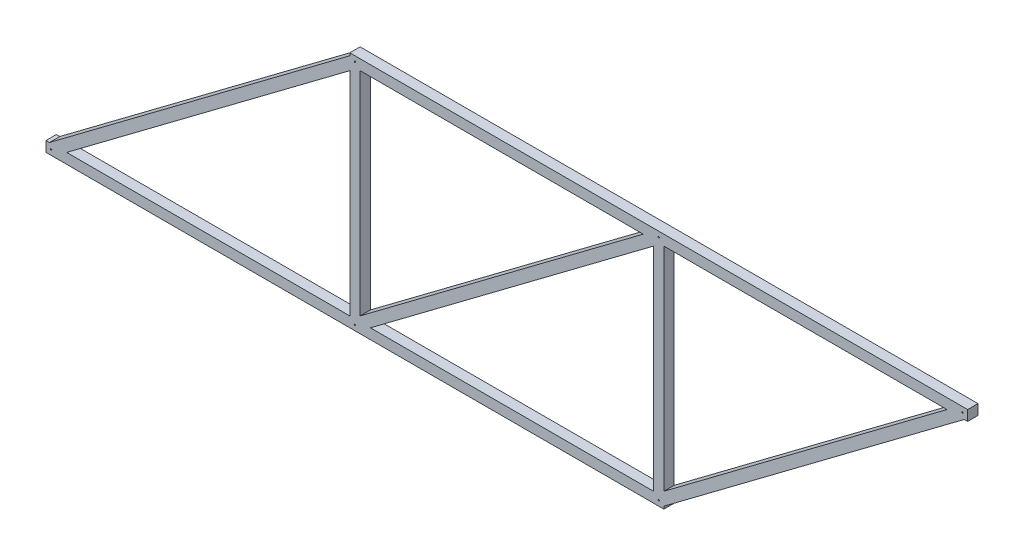
ISO-10303-21;
HEADER;
FILE_DESCRIPTION(('STEP AP214'),'2;1');
FILE_NAME('part.step','',(''),(''),'','','');
FILE_SCHEMA(('AUTOMOTIVE_DESIGN { 1 0 10303 214 1 1 1 1 }'));
ENDSEC;
DATA;
#1=APPLICATION_CONTEXT('core data for automotive mechanical design processes');
#2=APPLICATION_PROTOCOL_DEFINITION('international standard','automotive_design',2000,#1);
#3=PRODUCT_CONTEXT('',#1,'mechanical');
#4=PRODUCT('Part','Part','',(#3));
#5=PRODUCT_RELATED_PRODUCT_CATEGORY('part','',(#4));
#6=PRODUCT_DEFINITION_FORMATION('','',#4);
#7=PRODUCT_DEFINITION_CONTEXT('part definition',#1,'design');
#8=PRODUCT_DEFINITION('design','',#6,#7);
#9=PRODUCT_DEFINITION_SHAPE('','',#8);
#10=(LENGTH_UNIT() NAMED_UNIT(*) SI_UNIT(.MILLI.,.METRE.));
#11=(NAMED_UNIT(*) PLANE_ANGLE_UNIT() SI_UNIT($,.RADIAN.));
#12=(NAMED_UNIT(*) SI_UNIT($,.STERADIAN.) SOLID_ANGLE_UNIT());
#13=UNCERTAINTY_MEASURE_WITH_UNIT(LENGTH_MEASURE(1.E-05),#10,'distance_accuracy_value','');
#14=(GEOMETRIC_REPRESENTATION_CONTEXT(3) GLOBAL_UNCERTAINTY_ASSIGNED_CONTEXT((#13)) GLOBAL_UNIT_ASSIGNED_CONTEXT((#10,
#11,#12)) REPRESENTATION_CONTEXT('',''));
#15=CARTESIAN_POINT('',(0.,0.,0.));
#16=DIRECTION('',(0.,0.,1.));
#17=DIRECTION('',(1.,0.,0.));
#18=AXIS2_PLACEMENT_3D('',#15,#16,#17);
#19=CARTESIAN_POINT('',(0.,0.,13.6));
#20=DIRECTION('',(0.,0.,-1.));
#21=DIRECTION('',(-1.,0.,0.));
#22=AXIS2_PLACEMENT_3D('',#19,#20,#21);
#23=PLANE('',#22);
#24=DIRECTION('',(0.799999999956477,0.600000000058031,0.));
#25=VECTOR('',#24,1.);
#26=CARTESIAN_POINT('',(-394683.243710483,-296314.132827642,13.6));
#27=LINE('',#26,#25);
#28=CARTESIAN_POINT('',(406.799999999958,3.40000000039709,13.6));
#29=VERTEX_POINT('',#28);
#30=CARTESIAN_POINT('',(802.266666606442,300.000000000006,13.6));
#31=VERTEX_POINT('',#30);
#32=EDGE_CURVE('E708',#29,#31,#27,.T.);
#33=ORIENTED_EDGE('',*,*,#32,.T.);
#34=DIRECTION('',(-1.,1.22451067267071E-13,0.));
#35=VECTOR('',#34,1.);
#36=CARTESIAN_POINT('',(-399390.480730774,300.00000004901,13.6));
#37=LINE('',#36,#35);
#38=CARTESIAN_POINT('',(806.799999999967,300.000000000011,13.6));
#39=VERTEX_POINT('',#38);
#40=EDGE_CURVE('E711',#39,#31,#37,.T.);
#41=ORIENTED_EDGE('',*,*,#40,.F.);
#42=DIRECTION('',(1.14287664299616E-13,-1.,0.));
#43=VECTOR('',#42,1.);
#44=CARTESIAN_POINT('',(806.800000033149,-290037.816801442,13.6));
#45=LINE('',#44,#43);
#46=CARTESIAN_POINT('',(806.799999999953,313.60000000003,13.6));
#47=VERTEX_POINT('',#46);
#48=EDGE_CURVE('E716',#47,#39,#45,.T.);
#49=ORIENTED_EDGE('',*,*,#48,.F.);
#50=DIRECTION('',(1.,4.89804275566681E-13,0.));
#51=VECTOR('',#50,1.);
#52=CARTESIAN_POINT('',(-399390.480730952,313.599999804012,13.6));
#53=LINE('',#52,#51);
#54=CARTESIAN_POINT('',(-6.79999999998601,313.59999999961,13.6));
#55=VERTEX_POINT('',#54);
#56=EDGE_CURVE('E720',#55,#47,#53,.T.);
#57=ORIENTED_EDGE('',*,*,#56,.F.);
#58=DIRECTION('',(2.84698738951603E-13,1.,0.));
#59=VECTOR('',#58,1.);
#60=CARTESIAN_POINT('',(-6.80000008264869,-290037.816801602,13.6));
#61=LINE('',#60,#59);
#62=CARTESIAN_POINT('',(-6.79999999999836,310.200000045143,13.6));
#63=VERTEX_POINT('',#62);
#64=EDGE_CURVE('E724',#63,#55,#61,.T.);
#65=ORIENTED_EDGE('',*,*,#64,.F.);
#66=DIRECTION('',(-0.799999999956419,-0.600000000058108,0.));
#67=VECTOR('',#66,1.);
#68=CARTESIAN_POINT('',(-394979.403710511,-295919.252827664,13.6));
#69=LINE('',#68,#67);
#70=CARTESIAN_POINT('',(-402.266666667003,13.6000000000097,13.6));
#71=VERTEX_POINT('',#70);
#72=EDGE_CURVE('E728',#63,#71,#69,.T.);
#73=ORIENTED_EDGE('',*,*,#72,.T.);
#74=DIRECTION('',(1.,2.16585328116705E-13,0.));
#75=VECTOR('',#74,1.);
#76=CARTESIAN_POINT('',(-399390.480730873,13.5999999135947,13.6));
#77=LINE('',#76,#75);
#78=CARTESIAN_POINT('',(-406.799999999976,13.5999999999967,13.6));
#79=VERTEX_POINT('',#78);
#80=EDGE_CURVE('E731',#79,#71,#77,.T.);
#81=ORIENTED_EDGE('',*,*,#80,.F.);
#82=DIRECTION('',(0.,1.,0.));
#83=VECTOR('',#82,1.);
#84=CARTESIAN_POINT('',(-406.799999999976,-290037.816801488,13.6));
#85=LINE('',#84,#83);
#86=CARTESIAN_POINT('',(-406.799999999976,0.,13.6));
#87=VERTEX_POINT('',#86);
#88=EDGE_CURVE('E735',#87,#79,#85,.T.);
#89=ORIENTED_EDGE('',*,*,#88,.F.);
#90=DIRECTION('',(1.,0.,0.));
#91=VECTOR('',#90,1.);
#92=CARTESIAN_POINT('',(-399390.48073081,0.,13.6));
#93=LINE('',#92,#91);
#94=CARTESIAN_POINT('',(406.799999999958,0.,13.6));
#95=VERTEX_POINT('',#94);
#96=EDGE_CURVE('E739',#87,#95,#93,.T.);
#97=ORIENTED_EDGE('',*,*,#96,.T.);
#98=DIRECTION('',(0.,-1.,0.));
#99=VECTOR('',#98,1.);
#100=CARTESIAN_POINT('',(406.800000004694,-290037.816801481,13.6));
#101=LINE('',#100,#99);
#102=EDGE_CURVE('E742',#29,#95,#101,.T.);
#103=ORIENTED_EDGE('',*,*,#102,.F.);
#104=EDGE_LOOP('',(#33,#41,#49,#57,#65,#73,#81,#89,#97,#103));
#105=FACE_BOUND('',#104,.T.);
#106=DIRECTION('',(0.,-1.,0.));
#107=VECTOR('',#106,1.);
#108=CARTESIAN_POINT('',(393.199999999979,-290037.816801488,13.6));
#109=LINE('',#108,#107);
#110=CARTESIAN_POINT('',(393.199999999979,293.200000000012,13.6));
#111=VERTEX_POINT('',#110);
#112=CARTESIAN_POINT('',(393.199999999979,13.5999999999967,13.6));
#113=VERTEX_POINT('',#112);
#114=EDGE_CURVE('E684',#111,#113,#109,.T.);
#115=ORIENTED_EDGE('',*,*,#114,.T.);
#116=DIRECTION('',(-1.,0.,0.));
#117=VECTOR('',#116,1.);
#118=CARTESIAN_POINT('',(-399390.480730808,13.6000000028957,13.6));
#119=LINE('',#118,#117);
#120=CARTESIAN_POINT('',(20.3999999999951,13.5999999999967,13.6));
#121=VERTEX_POINT('',#120);
#122=EDGE_CURVE('E675',#113,#121,#119,.T.);
#123=ORIENTED_EDGE('',*,*,#122,.T.);
#124=DIRECTION('',(0.8,0.599999999999999,0.));
#125=VECTOR('',#124,1.);
#126=CARTESIAN_POINT('',(-394827.243732433,-296122.132799324,13.6));
#127=LINE('',#126,#125);
#128=EDGE_CURVE('E679',#121,#111,#127,.T.);
#129=ORIENTED_EDGE('',*,*,#128,.T.);
#130=EDGE_LOOP('',(#115,#123,#129));
#131=FACE_BOUND('',#130,.T.);
#132=DIRECTION('',(0.,-1.,0.));
#133=VECTOR('',#132,1.);
#134=CARTESIAN_POINT('',(-6.79999999999836,-290037.816801488,13.6));
#135=LINE('',#134,#133);
#136=CARTESIAN_POINT('',(-6.79999999999567,293.200000044165,13.6));
#137=VERTEX_POINT('',#136);
#138=CARTESIAN_POINT('',(-6.79999999999566,13.5999999999967,13.6));
#139=VERTEX_POINT('',#138);
#140=EDGE_CURVE('E651',#137,#139,#135,.T.);
#141=ORIENTED_EDGE('',*,*,#140,.T.);
#142=DIRECTION('',(-1.,0.,0.));
#143=VECTOR('',#142,1.);
#144=CARTESIAN_POINT('',(-399390.480730812,13.5999999978935,13.6));
#145=LINE('',#144,#143);
#146=CARTESIAN_POINT('',(-379.60000000237,13.6000000000536,13.6));
#147=VERTEX_POINT('',#146);
#148=EDGE_CURVE('E642',#139,#147,#145,.T.);
#149=ORIENTED_EDGE('',*,*,#148,.T.);
#150=DIRECTION('',(0.799999999956397,0.600000000058138,0.));
#151=VECTOR('',#150,1.);
#152=CARTESIAN_POINT('',(-394971.243710498,-295930.132827678,13.6));
#153=LINE('',#152,#151);
#154=EDGE_CURVE('E646',#147,#137,#153,.T.);
#155=ORIENTED_EDGE('',*,*,#154,.T.);
#156=EDGE_LOOP('',(#141,#149,#155));
#157=FACE_BOUND('',#156,.T.);
#158=DIRECTION('',(0.,1.,0.));
#159=VECTOR('',#158,1.);
#160=CARTESIAN_POINT('',(6.80000000005521,-290037.816801488,13.6));
#161=LINE('',#160,#159);
#162=CARTESIAN_POINT('',(6.80000000002011,20.4000000000043,13.6));
#163=VERTEX_POINT('',#162);
#164=CARTESIAN_POINT('',(6.80000000002008,300.000000000011,13.6));
#165=VERTEX_POINT('',#164);
#166=EDGE_CURVE('E618',#163,#165,#161,.T.);
#167=ORIENTED_EDGE('',*,*,#166,.T.);
#168=DIRECTION('',(1.,0.,0.));
#169=VECTOR('',#168,1.);
#170=CARTESIAN_POINT('',(-399390.48073081,299.999999999955,13.6));
#171=LINE('',#170,#169);
#172=CARTESIAN_POINT('',(379.600000000039,300.000000000011,13.6));
#173=VERTEX_POINT('',#172);
#174=EDGE_CURVE('E610',#165,#173,#171,.T.);
#175=ORIENTED_EDGE('',*,*,#174,.T.);
#176=DIRECTION('',(-0.800000000000001,-0.599999999999999,0.));
#177=VECTOR('',#176,1.);
#178=CARTESIAN_POINT('',(-394835.403732433,-296111.252799324,13.6));
#179=LINE('',#178,#177);
#180=EDGE_CURVE('E613',#173,#163,#179,.T.);
#181=ORIENTED_EDGE('',*,*,#180,.T.);
#182=EDGE_LOOP('',(#167,#175,#181));
#183=FACE_BOUND('',#182,.T.);
#184=DIRECTION('',(0.,-1.,0.));
#185=VECTOR('',#184,1.);
#186=CARTESIAN_POINT('',(406.799999999976,-290037.816801488,13.6));
#187=LINE('',#186,#185);
#188=CARTESIAN_POINT('',(406.799999999976,300.000000000011,13.6));
#189=VERTEX_POINT('',#188);
#190=CARTESIAN_POINT('',(406.800000000146,20.4000000013593,13.6));
#191=VERTEX_POINT('',#190);
#192=EDGE_CURVE('E569',#189,#191,#187,.T.);
#193=ORIENTED_EDGE('',*,*,#192,.F.);
#194=DIRECTION('',(1.,0.,0.));
#195=VECTOR('',#194,1.);
#196=CARTESIAN_POINT('',(-399390.48073081,300.000000000011,13.6));
#197=LINE('',#196,#195);
#198=CARTESIAN_POINT('',(779.59999994215,300.000000000011,13.6));
#199=VERTEX_POINT('',#198);
#200=EDGE_CURVE('E588',#189,#199,#197,.T.);
#201=ORIENTED_EDGE('',*,*,#200,.T.);
#202=DIRECTION('',(-0.799999999956481,-0.600000000058026,0.));
#203=VECTOR('',#202,1.);
#204=CARTESIAN_POINT('',(-394691.403710486,-296303.25282764,13.6));
#205=LINE('',#204,#203);
#206=EDGE_CURVE('E437',#199,#191,#205,.T.);
#207=ORIENTED_EDGE('',*,*,#206,.T.);
#208=EDGE_LOOP('',(#193,#201,#207));
#209=FACE_BOUND('',#208,.T.);
#210=CARTESIAN_POINT('',(0.107289977300017,306.8,13.6));
#211=DIRECTION('',(0.,0.,1.));
#212=DIRECTION('',(1.,0.,0.));
#213=AXIS2_PLACEMENT_3D('',#210,#211,#212);
#214=CIRCLE('',#213,0.849999999999997);
#215=CARTESIAN_POINT('',(0.957289977300014,306.8,13.6));
#216=VERTEX_POINT('',#215);
#217=EDGE_CURVE('E600',#216,#216,#214,.T.);
#218=ORIENTED_EDGE('',*,*,#217,.F.);
#219=EDGE_LOOP('',(#218));
#220=FACE_BOUND('',#219,.T.);
#221=CARTESIAN_POINT('',(-399.999999939599,6.79999999999997,13.6));
#222=DIRECTION('',(0.,0.,1.));
#223=DIRECTION('',(1.,0.,0.));
#224=AXIS2_PLACEMENT_3D('',#221,#222,#223);
#225=CIRCLE('',#224,0.850000000000034);
#226=CARTESIAN_POINT('',(-399.149999939599,6.79999999999997,13.6));
#227=VERTEX_POINT('',#226);
#228=EDGE_CURVE('E1195',#227,#227,#225,.T.);
#229=ORIENTED_EDGE('',*,*,#228,.F.);
#230=EDGE_LOOP('',(#229));
#231=FACE_BOUND('',#230,.T.);
#232=CARTESIAN_POINT('',(-4.64721266462108E-11,6.79999999999786,13.6));
#233=DIRECTION('',(0.,0.,1.));
#234=DIRECTION('',(1.,0.,0.));
#235=AXIS2_PLACEMENT_3D('',#232,#233,#234);
#236=CIRCLE('',#235,0.85);
#237=CARTESIAN_POINT('',(0.849999999953528,6.79999999999786,13.6));
#238=VERTEX_POINT('',#237);
#239=EDGE_CURVE('E1188',#238,#238,#236,.T.);
#240=ORIENTED_EDGE('',*,*,#239,.F.);
#241=EDGE_LOOP('',(#240));
#242=FACE_BOUND('',#241,.T.);
#243=CARTESIAN_POINT('',(400.,6.80000000000037,13.6));
#244=DIRECTION('',(0.,0.,1.));
#245=DIRECTION('',(1.,0.,0.));
#246=AXIS2_PLACEMENT_3D('',#243,#244,#245);
#247=CIRCLE('',#246,0.850000000000034);
#248=CARTESIAN_POINT('',(400.85,6.80000000000037,13.6));
#249=VERTEX_POINT('',#248);
#250=EDGE_CURVE('E1180',#249,#249,#247,.T.);
#251=ORIENTED_EDGE('',*,*,#250,.F.);
#252=EDGE_LOOP('',(#251));
#253=FACE_BOUND('',#252,.T.);
#254=CARTESIAN_POINT('',(799.999999999954,306.8,13.6));
#255=DIRECTION('',(0.,0.,1.));
#256=DIRECTION('',(1.,0.,0.));
#257=AXIS2_PLACEMENT_3D('',#254,#255,#256);
#258=CIRCLE('',#257,0.849999999999977);
#259=CARTESIAN_POINT('',(800.849999999954,306.8,13.6));
#260=VERTEX_POINT('',#259);
#261=EDGE_CURVE('E1172',#260,#260,#258,.T.);
#262=ORIENTED_EDGE('',*,*,#261,.F.);
#263=EDGE_LOOP('',(#262));
#264=FACE_BOUND('',#263,.T.);
#265=CARTESIAN_POINT('',(400.,306.8,13.6));
#266=DIRECTION('',(0.,0.,1.));
#267=DIRECTION('',(1.,0.,0.));
#268=AXIS2_PLACEMENT_3D('',#265,#266,#267);
#269=CIRCLE('',#268,0.85000000000003);
#270=CARTESIAN_POINT('',(400.85,306.8,13.6));
#271=VERTEX_POINT('',#270);
#272=EDGE_CURVE('E1161',#271,#271,#269,.T.);
#273=ORIENTED_EDGE('',*,*,#272,.F.);
#274=EDGE_LOOP('',(#273));
#275=FACE_BOUND('',#274,.T.);
#276=ADVANCED_FACE('F421',(#105,#131,#157,#183,#209,#220,#231,#242,#253,#264,#275),#23,.F.);
#277=CARTESIAN_POINT('',(0.,0.,0.));
#278=DIRECTION('',(0.,0.,-1.));
#279=DIRECTION('',(-1.,0.,0.));
#280=AXIS2_PLACEMENT_3D('',#277,#278,#279);
#281=PLANE('',#280);
#282=CARTESIAN_POINT('',(799.999999999954,306.8,0.));
#283=DIRECTION('',(0.,0.,1.));
#284=DIRECTION('',(1.,0.,0.));
#285=AXIS2_PLACEMENT_3D('',#282,#283,#284);
#286=CIRCLE('',#285,0.849999999999977);
#287=CARTESIAN_POINT('',(800.849999999954,306.8,0.));
#288=VERTEX_POINT('',#287);
#289=EDGE_CURVE('E1169',#288,#288,#286,.T.);
#290=ORIENTED_EDGE('',*,*,#289,.T.);
#291=EDGE_LOOP('',(#290));
#292=FACE_BOUND('',#291,.T.);
#293=CARTESIAN_POINT('',(-4.64721266462108E-11,6.79999999999786,0.));
#294=DIRECTION('',(0.,0.,1.));
#295=DIRECTION('',(1.,0.,0.));
#296=AXIS2_PLACEMENT_3D('',#293,#294,#295);
#297=CIRCLE('',#296,0.85);
#298=CARTESIAN_POINT('',(0.849999999953528,6.79999999999786,0.));
#299=VERTEX_POINT('',#298);
#300=EDGE_CURVE('E1184',#299,#299,#297,.T.);
#301=ORIENTED_EDGE('',*,*,#300,.T.);
#302=EDGE_LOOP('',(#301));
#303=FACE_BOUND('',#302,.T.);
#304=CARTESIAN_POINT('',(0.107289977300017,306.8,0.));
#305=DIRECTION('',(0.,0.,1.));
#306=DIRECTION('',(1.,0.,0.));
#307=AXIS2_PLACEMENT_3D('',#304,#305,#306);
#308=CIRCLE('',#307,0.849999999999997);
#309=CARTESIAN_POINT('',(0.957289977300014,306.8,0.));
#310=VERTEX_POINT('',#309);
#311=EDGE_CURVE('E1199',#310,#310,#308,.T.);
#312=ORIENTED_EDGE('',*,*,#311,.T.);
#313=EDGE_LOOP('',(#312));
#314=FACE_BOUND('',#313,.T.);
#315=DIRECTION('',(1.,0.,0.));
#316=VECTOR('',#315,1.);
#317=CARTESIAN_POINT('',(-399390.48073081,299.999999999955,0.));
#318=LINE('',#317,#316);
#319=CARTESIAN_POINT('',(6.80000000002008,300.000000000011,0.));
#320=VERTEX_POINT('',#319);
#321=CARTESIAN_POINT('',(379.600000000039,300.000000000017,0.));
#322=VERTEX_POINT('',#321);
#323=EDGE_CURVE('E584',#320,#322,#318,.T.);
#324=ORIENTED_EDGE('',*,*,#323,.F.);
#325=DIRECTION('',(0.,1.,0.));
#326=VECTOR('',#325,1.);
#327=CARTESIAN_POINT('',(6.80000000005521,-290037.816801488,0.));
#328=LINE('',#327,#326);
#329=CARTESIAN_POINT('',(6.80000000002011,20.3999999999951,0.));
#330=VERTEX_POINT('',#329);
#331=EDGE_CURVE('E614',#330,#320,#328,.T.);
#332=ORIENTED_EDGE('',*,*,#331,.F.);
#333=DIRECTION('',(-0.800000000000001,-0.599999999999999,0.));
#334=VECTOR('',#333,1.);
#335=CARTESIAN_POINT('',(-394835.403732433,-296111.252799324,0.));
#336=LINE('',#335,#334);
#337=EDGE_CURVE('E625',#322,#330,#336,.T.);
#338=ORIENTED_EDGE('',*,*,#337,.F.);
#339=EDGE_LOOP('',(#324,#332,#338));
#340=FACE_BOUND('',#339,.T.);
#341=DIRECTION('',(-1.,0.,0.));
#342=VECTOR('',#341,1.);
#343=CARTESIAN_POINT('',(-399390.480730812,13.5999999978935,0.));
#344=LINE('',#343,#342);
#345=CARTESIAN_POINT('',(-6.79999999999566,13.5999999999967,0.));
#346=VERTEX_POINT('',#345);
#347=CARTESIAN_POINT('',(-379.60000000237,13.6000000000527,0.));
#348=VERTEX_POINT('',#347);
#349=EDGE_CURVE('E635',#346,#348,#344,.T.);
#350=ORIENTED_EDGE('',*,*,#349,.F.);
#351=DIRECTION('',(0.,-1.,0.));
#352=VECTOR('',#351,1.);
#353=CARTESIAN_POINT('',(-6.79999999999836,-290037.816801488,0.));
#354=LINE('',#353,#352);
#355=CARTESIAN_POINT('',(-6.79999999999566,293.200000044237,0.));
#356=VERTEX_POINT('',#355);
#357=EDGE_CURVE('E647',#356,#346,#354,.T.);
#358=ORIENTED_EDGE('',*,*,#357,.F.);
#359=DIRECTION('',(0.799999999956397,0.600000000058138,0.));
#360=VECTOR('',#359,1.);
#361=CARTESIAN_POINT('',(-394971.243710498,-295930.132827678,0.));
#362=LINE('',#361,#360);
#363=EDGE_CURVE('E658',#348,#356,#362,.T.);
#364=ORIENTED_EDGE('',*,*,#363,.F.);
#365=EDGE_LOOP('',(#350,#358,#364));
#366=FACE_BOUND('',#365,.T.);
#367=DIRECTION('',(-1.,0.,0.));
#368=VECTOR('',#367,1.);
#369=CARTESIAN_POINT('',(-399390.480730808,13.6000000028957,0.));
#370=LINE('',#369,#368);
#371=CARTESIAN_POINT('',(393.199999999979,13.5999999999967,0.));
#372=VERTEX_POINT('',#371);
#373=CARTESIAN_POINT('',(20.3999999999951,13.6000000000251,0.));
#374=VERTEX_POINT('',#373);
#375=EDGE_CURVE('E668',#372,#374,#370,.T.);
#376=ORIENTED_EDGE('',*,*,#375,.F.);
#377=DIRECTION('',(0.,-1.,0.));
#378=VECTOR('',#377,1.);
#379=CARTESIAN_POINT('',(393.199999999979,-290037.816801488,0.));
#380=LINE('',#379,#378);
#381=CARTESIAN_POINT('',(393.199999999979,293.20000000007,0.));
#382=VERTEX_POINT('',#381);
#383=EDGE_CURVE('E680',#382,#372,#380,.T.);
#384=ORIENTED_EDGE('',*,*,#383,.F.);
#385=DIRECTION('',(0.8,0.599999999999999,0.));
#386=VECTOR('',#385,1.);
#387=CARTESIAN_POINT('',(-394827.243732433,-296122.132799324,0.));
#388=LINE('',#387,#386);
#389=EDGE_CURVE('E691',#374,#382,#388,.T.);
#390=ORIENTED_EDGE('',*,*,#389,.F.);
#391=EDGE_LOOP('',(#376,#384,#390));
#392=FACE_BOUND('',#391,.T.);
#393=DIRECTION('',(0.799999999956477,0.600000000058031,0.));
#394=VECTOR('',#393,1.);
#395=CARTESIAN_POINT('',(-394683.243710483,-296314.132827642,0.));
#396=LINE('',#395,#394);
#397=CARTESIAN_POINT('',(406.799999999958,3.40000000039709,0.));
#398=VERTEX_POINT('',#397);
#399=CARTESIAN_POINT('',(802.266666606442,300.000000000006,0.));
#400=VERTEX_POINT('',#399);
#401=EDGE_CURVE('E701',#398,#400,#396,.T.);
#402=ORIENTED_EDGE('',*,*,#401,.F.);
#403=DIRECTION('',(0.,-1.,0.));
#404=VECTOR('',#403,1.);
#405=CARTESIAN_POINT('',(406.800000004694,-290037.816801481,0.));
#406=LINE('',#405,#404);
#407=CARTESIAN_POINT('',(406.799999999958,0.,0.));
#408=VERTEX_POINT('',#407);
#409=EDGE_CURVE('E712',#398,#408,#406,.T.);
#410=ORIENTED_EDGE('',*,*,#409,.T.);
#411=DIRECTION('',(1.,0.,0.));
#412=VECTOR('',#411,1.);
#413=CARTESIAN_POINT('',(-399390.48073081,0.,0.));
#414=LINE('',#413,#412);
#415=CARTESIAN_POINT('',(-406.799999999976,0.,0.));
#416=VERTEX_POINT('',#415);
#417=EDGE_CURVE('E778',#416,#408,#414,.T.);
#418=ORIENTED_EDGE('',*,*,#417,.F.);
#419=DIRECTION('',(0.,1.,0.));
#420=VECTOR('',#419,1.);
#421=CARTESIAN_POINT('',(-406.799999999976,-290037.816801488,0.));
#422=LINE('',#421,#420);
#423=CARTESIAN_POINT('',(-406.799999999976,13.5999999999967,0.));
#424=VERTEX_POINT('',#423);
#425=EDGE_CURVE('E774',#416,#424,#422,.T.);
#426=ORIENTED_EDGE('',*,*,#425,.T.);
#427=DIRECTION('',(1.,2.16585328116705E-13,0.));
#428=VECTOR('',#427,1.);
#429=CARTESIAN_POINT('',(-399390.480730873,13.5999999135947,0.));
#430=LINE('',#429,#428);
#431=CARTESIAN_POINT('',(-402.266666667003,13.6000000000097,0.));
#432=VERTEX_POINT('',#431);
#433=EDGE_CURVE('E770',#424,#432,#430,.T.);
#434=ORIENTED_EDGE('',*,*,#433,.T.);
#435=DIRECTION('',(-0.799999999956419,-0.600000000058108,0.));
#436=VECTOR('',#435,1.);
#437=CARTESIAN_POINT('',(-394979.403710511,-295919.252827664,0.));
#438=LINE('',#437,#436);
#439=CARTESIAN_POINT('',(-6.79999999999836,310.200000045143,0.));
#440=VERTEX_POINT('',#439);
#441=EDGE_CURVE('E766',#440,#432,#438,.T.);
#442=ORIENTED_EDGE('',*,*,#441,.F.);
#443=DIRECTION('',(2.84698738951603E-13,1.,0.));
#444=VECTOR('',#443,1.);
#445=CARTESIAN_POINT('',(-6.80000008264869,-290037.816801602,0.));
#446=LINE('',#445,#444);
#447=CARTESIAN_POINT('',(-6.79999999998601,313.59999999961,0.));
#448=VERTEX_POINT('',#447);
#449=EDGE_CURVE('E762',#440,#448,#446,.T.);
#450=ORIENTED_EDGE('',*,*,#449,.T.);
#451=DIRECTION('',(1.,4.89804275566681E-13,0.));
#452=VECTOR('',#451,1.);
#453=CARTESIAN_POINT('',(-399390.480730952,313.599999804012,0.));
#454=LINE('',#453,#452);
#455=CARTESIAN_POINT('',(806.799999999953,313.60000000003,0.));
#456=VERTEX_POINT('',#455);
#457=EDGE_CURVE('E758',#448,#456,#454,.T.);
#458=ORIENTED_EDGE('',*,*,#457,.T.);
#459=DIRECTION('',(1.14287664299616E-13,-1.,0.));
#460=VECTOR('',#459,1.);
#461=CARTESIAN_POINT('',(806.800000033149,-290037.816801442,0.));
#462=LINE('',#461,#460);
#463=CARTESIAN_POINT('',(806.799999999967,300.000000000011,0.));
#464=VERTEX_POINT('',#463);
#465=EDGE_CURVE('E754',#456,#464,#462,.T.);
#466=ORIENTED_EDGE('',*,*,#465,.T.);
#467=DIRECTION('',(-1.,1.22451067267071E-13,0.));
#468=VECTOR('',#467,1.);
#469=CARTESIAN_POINT('',(-399390.480730774,300.00000004901,0.));
#470=LINE('',#469,#468);
#471=EDGE_CURVE('E750',#464,#400,#470,.T.);
#472=ORIENTED_EDGE('',*,*,#471,.T.);
#473=EDGE_LOOP('',(#402,#410,#418,#426,#434,#442,#450,#458,#466,#472));
#474=FACE_BOUND('',#473,.T.);
#475=DIRECTION('',(1.,0.,0.));
#476=VECTOR('',#475,1.);
#477=CARTESIAN_POINT('',(-399390.48073081,300.000000000011,0.));
#478=LINE('',#477,#476);
#479=CARTESIAN_POINT('',(406.799999999976,300.000000000011,0.));
#480=VERTEX_POINT('',#479);
#481=CARTESIAN_POINT('',(779.59999994215,300.000000000011,0.));
#482=VERTEX_POINT('',#481);
#483=EDGE_CURVE('E578',#480,#482,#478,.T.);
#484=ORIENTED_EDGE('',*,*,#483,.F.);
#485=DIRECTION('',(0.,-1.,0.));
#486=VECTOR('',#485,1.);
#487=CARTESIAN_POINT('',(406.799999999976,-290037.816801488,0.));
#488=LINE('',#487,#486);
#489=CARTESIAN_POINT('',(406.800000000146,20.4000000013593,0.));
#490=VERTEX_POINT('',#489);
#491=EDGE_CURVE('E445',#480,#490,#488,.T.);
#492=ORIENTED_EDGE('',*,*,#491,.T.);
#493=DIRECTION('',(-0.799999999956481,-0.600000000058026,0.));
#494=VECTOR('',#493,1.);
#495=CARTESIAN_POINT('',(-394691.403710486,-296303.25282764,0.));
#496=LINE('',#495,#494);
#497=EDGE_CURVE('E582',#482,#490,#496,.T.);
#498=ORIENTED_EDGE('',*,*,#497,.F.);
#499=EDGE_LOOP('',(#484,#492,#498));
#500=FACE_BOUND('',#499,.T.);
#501=CARTESIAN_POINT('',(-399.999999939599,6.79999999999997,0.));
#502=DIRECTION('',(0.,0.,1.));
#503=DIRECTION('',(1.,0.,0.));
#504=AXIS2_PLACEMENT_3D('',#501,#502,#503);
#505=CIRCLE('',#504,0.850000000000034);
#506=CARTESIAN_POINT('',(-399.149999939599,6.79999999999997,0.));
#507=VERTEX_POINT('',#506);
#508=EDGE_CURVE('E1192',#507,#507,#505,.T.);
#509=ORIENTED_EDGE('',*,*,#508,.T.);
#510=EDGE_LOOP('',(#509));
#511=FACE_BOUND('',#510,.T.);
#512=CARTESIAN_POINT('',(400.,6.80000000000037,0.));
#513=DIRECTION('',(0.,0.,1.));
#514=DIRECTION('',(1.,0.,0.));
#515=AXIS2_PLACEMENT_3D('',#512,#513,#514);
#516=CIRCLE('',#515,0.850000000000034);
#517=CARTESIAN_POINT('',(400.85,6.80000000000037,0.));
#518=VERTEX_POINT('',#517);
#519=EDGE_CURVE('E1176',#518,#518,#516,.T.);
#520=ORIENTED_EDGE('',*,*,#519,.T.);
#521=EDGE_LOOP('',(#520));
#522=FACE_BOUND('',#521,.T.);
#523=CARTESIAN_POINT('',(400.,306.8,0.));
#524=DIRECTION('',(0.,0.,1.));
#525=DIRECTION('',(1.,0.,0.));
#526=AXIS2_PLACEMENT_3D('',#523,#524,#525);
#527=CIRCLE('',#526,0.85000000000003);
#528=CARTESIAN_POINT('',(400.85,306.8,0.));
#529=VERTEX_POINT('',#528);
#530=EDGE_CURVE('E1164',#529,#529,#527,.T.);
#531=ORIENTED_EDGE('',*,*,#530,.T.);
#532=EDGE_LOOP('',(#531));
#533=FACE_BOUND('',#532,.T.);
#534=ADVANCED_FACE('F821',(#292,#303,#314,#340,#366,#392,#474,#500,#511,#522,#533),#281,.T.);
#535=CARTESIAN_POINT('',(-394683.243710483,-296314.132827642,13.6));
#536=DIRECTION('',(-0.600000000058031,0.799999999956477,0.));
#537=DIRECTION('',(-0.799999999956477,-0.600000000058031,0.));
#538=AXIS2_PLACEMENT_3D('',#535,#536,#537);
#539=PLANE('',#538);
#540=ORIENTED_EDGE('',*,*,#401,.T.);
#541=DIRECTION('',(0.,0.,-1.));
#542=VECTOR('',#541,1.);
#543=CARTESIAN_POINT('',(802.266666606442,300.000000000006,13.6));
#544=LINE('',#543,#542);
#545=EDGE_CURVE('E12',#31,#400,#544,.T.);
#546=ORIENTED_EDGE('',*,*,#545,.F.);
#547=ORIENTED_EDGE('',*,*,#32,.F.);
#548=DIRECTION('',(0.,0.,-1.));
#549=VECTOR('',#548,1.);
#550=CARTESIAN_POINT('',(406.799999999958,3.40000000039709,13.6));
#551=LINE('',#550,#549);
#552=EDGE_CURVE('E746',#29,#398,#551,.T.);
#553=ORIENTED_EDGE('',*,*,#552,.T.);
#554=EDGE_LOOP('',(#540,#546,#547,#553));
#555=FACE_BOUND('',#554,.T.);
#556=ADVANCED_FACE('F423',(#555),#539,.F.);
#557=CARTESIAN_POINT('',(-399390.480730774,300.00000004901,13.6));
#558=DIRECTION('',(-1.22451067267071E-13,-1.,0.));
#559=DIRECTION('',(1.,-1.22451067267071E-13,0.));
#560=AXIS2_PLACEMENT_3D('',#557,#558,#559);
#561=PLANE('',#560);
#562=ORIENTED_EDGE('',*,*,#471,.F.);
#563=DIRECTION('',(0.,0.,-1.));
#564=VECTOR('',#563,1.);
#565=CARTESIAN_POINT('',(806.799999999967,300.000000000011,13.6));
#566=LINE('',#565,#564);
#567=EDGE_CURVE('E430',#39,#464,#566,.T.);
#568=ORIENTED_EDGE('',*,*,#567,.F.);
#569=ORIENTED_EDGE('',*,*,#40,.T.);
#570=ORIENTED_EDGE('',*,*,#545,.T.);
#571=EDGE_LOOP('',(#562,#568,#569,#570));
#572=FACE_BOUND('',#571,.T.);
#573=ADVANCED_FACE('F817',(#572),#561,.T.);
#574=CARTESIAN_POINT('',(806.800000033149,-290037.816801442,13.6));
#575=DIRECTION('',(1.,1.14287664299616E-13,0.));
#576=DIRECTION('',(-1.14287664299616E-13,1.,0.));
#577=AXIS2_PLACEMENT_3D('',#574,#575,#576);
#578=PLANE('',#577);
#579=ORIENTED_EDGE('',*,*,#465,.F.);
#580=DIRECTION('',(0.,0.,-1.));
#581=VECTOR('',#580,1.);
#582=CARTESIAN_POINT('',(806.799999999953,313.60000000003,13.6));
#583=LINE('',#582,#581);
#584=EDGE_CURVE('E805',#47,#456,#583,.T.);
#585=ORIENTED_EDGE('',*,*,#584,.F.);
#586=ORIENTED_EDGE('',*,*,#48,.T.);
#587=ORIENTED_EDGE('',*,*,#567,.T.);
#588=EDGE_LOOP('',(#579,#585,#586,#587));
#589=FACE_BOUND('',#588,.T.);
#590=ADVANCED_FACE('F813',(#589),#578,.T.);
#591=CARTESIAN_POINT('',(-399390.480730952,313.599999804012,13.6));
#592=DIRECTION('',(-4.89804275566681E-13,1.,0.));
#593=DIRECTION('',(-1.,-4.89804275566681E-13,0.));
#594=AXIS2_PLACEMENT_3D('',#591,#592,#593);
#595=PLANE('',#594);
#596=ORIENTED_EDGE('',*,*,#457,.F.);
#597=DIRECTION('',(0.,0.,-1.));
#598=VECTOR('',#597,1.);
#599=CARTESIAN_POINT('',(-6.79999999998601,313.59999999961,13.6));
#600=LINE('',#599,#598);
#601=EDGE_CURVE('E802',#55,#448,#600,.T.);
#602=ORIENTED_EDGE('',*,*,#601,.F.);
#603=ORIENTED_EDGE('',*,*,#56,.T.);
#604=ORIENTED_EDGE('',*,*,#584,.T.);
#605=EDGE_LOOP('',(#596,#602,#603,#604));
#606=FACE_BOUND('',#605,.T.);
#607=ADVANCED_FACE('F827',(#606),#595,.T.);
#608=CARTESIAN_POINT('',(-6.80000008264869,-290037.816801602,13.6));
#609=DIRECTION('',(-1.,2.84698738951603E-13,0.));
#610=DIRECTION('',(-2.84698738951603E-13,-1.,0.));
#611=AXIS2_PLACEMENT_3D('',#608,#609,#610);
#612=PLANE('',#611);
#613=ORIENTED_EDGE('',*,*,#449,.F.);
#614=DIRECTION('',(0.,0.,-1.));
#615=VECTOR('',#614,1.);
#616=CARTESIAN_POINT('',(-6.79999999999836,310.200000045143,13.6));
#617=LINE('',#616,#615);
#618=EDGE_CURVE('E799',#63,#440,#617,.T.);
#619=ORIENTED_EDGE('',*,*,#618,.F.);
#620=ORIENTED_EDGE('',*,*,#64,.T.);
#621=ORIENTED_EDGE('',*,*,#601,.T.);
#622=EDGE_LOOP('',(#613,#619,#620,#621));
#623=FACE_BOUND('',#622,.T.);
#624=ADVANCED_FACE('F854',(#623),#612,.T.);
#625=CARTESIAN_POINT('',(-394979.403710511,-295919.252827664,13.6));
#626=DIRECTION('',(0.600000000058108,-0.799999999956419,0.));
#627=DIRECTION('',(0.799999999956419,0.600000000058108,0.));
#628=AXIS2_PLACEMENT_3D('',#625,#626,#627);
#629=PLANE('',#628);
#630=ORIENTED_EDGE('',*,*,#441,.T.);
#631=DIRECTION('',(0.,0.,-1.));
#632=VECTOR('',#631,1.);
#633=CARTESIAN_POINT('',(-402.266666667003,13.6000000000097,13.6));
#634=LINE('',#633,#632);
#635=EDGE_CURVE('E796',#71,#432,#634,.T.);
#636=ORIENTED_EDGE('',*,*,#635,.F.);
#637=ORIENTED_EDGE('',*,*,#72,.F.);
#638=ORIENTED_EDGE('',*,*,#618,.T.);
#639=EDGE_LOOP('',(#630,#636,#637,#638));
#640=FACE_BOUND('',#639,.T.);
#641=ADVANCED_FACE('F856',(#640),#629,.F.);
#642=CARTESIAN_POINT('',(-399390.480730873,13.5999999135947,13.6));
#643=DIRECTION('',(-2.16585328116705E-13,1.,0.));
#644=DIRECTION('',(-1.,-2.16585328116705E-13,0.));
#645=AXIS2_PLACEMENT_3D('',#642,#643,#644);
#646=PLANE('',#645);
#647=ORIENTED_EDGE('',*,*,#433,.F.);
#648=DIRECTION('',(0.,0.,-1.));
#649=VECTOR('',#648,1.);
#650=CARTESIAN_POINT('',(-406.799999999976,13.5999999999967,13.6));
#651=LINE('',#650,#649);
#652=EDGE_CURVE('E793',#79,#424,#651,.T.);
#653=ORIENTED_EDGE('',*,*,#652,.F.);
#654=ORIENTED_EDGE('',*,*,#80,.T.);
#655=ORIENTED_EDGE('',*,*,#635,.T.);
#656=EDGE_LOOP('',(#647,#653,#654,#655));
#657=FACE_BOUND('',#656,.T.);
#658=ADVANCED_FACE('F850',(#657),#646,.T.);
#659=CARTESIAN_POINT('',(-406.799999999976,-290037.816801488,13.6));
#660=DIRECTION('',(-1.,0.,0.));
#661=DIRECTION('',(0.,0.,1.));
#662=AXIS2_PLACEMENT_3D('',#659,#660,#661);
#663=PLANE('',#662);
#664=ORIENTED_EDGE('',*,*,#425,.F.);
#665=DIRECTION('',(0.,0.,-1.));
#666=VECTOR('',#665,1.);
#667=CARTESIAN_POINT('',(-406.799999999976,0.,13.6));
#668=LINE('',#667,#666);
#669=EDGE_CURVE('E790',#87,#416,#668,.T.);
#670=ORIENTED_EDGE('',*,*,#669,.F.);
#671=ORIENTED_EDGE('',*,*,#88,.T.);
#672=ORIENTED_EDGE('',*,*,#652,.T.);
#673=EDGE_LOOP('',(#664,#670,#671,#672));
#674=FACE_BOUND('',#673,.T.);
#675=ADVANCED_FACE('F845',(#674),#663,.T.);
#676=CARTESIAN_POINT('',(-399390.48073081,0.,13.6));
#677=DIRECTION('',(0.,1.,0.));
#678=DIRECTION('',(0.,0.,1.));
#679=AXIS2_PLACEMENT_3D('',#676,#677,#678);
#680=PLANE('',#679);
#681=ORIENTED_EDGE('',*,*,#417,.T.);
#682=DIRECTION('',(0.,0.,-1.));
#683=VECTOR('',#682,1.);
#684=CARTESIAN_POINT('',(406.799999999958,0.,13.6));
#685=LINE('',#684,#683);
#686=EDGE_CURVE('E787',#95,#408,#685,.T.);
#687=ORIENTED_EDGE('',*,*,#686,.F.);
#688=ORIENTED_EDGE('',*,*,#96,.F.);
#689=ORIENTED_EDGE('',*,*,#669,.T.);
#690=EDGE_LOOP('',(#681,#687,#688,#689));
#691=FACE_BOUND('',#690,.T.);
#692=ADVANCED_FACE('F842',(#691),#680,.F.);
#693=CARTESIAN_POINT('',(406.800000004694,-290037.816801481,13.6));
#694=DIRECTION('',(1.,0.,0.));
#695=DIRECTION('',(0.,1.,0.));
#696=AXIS2_PLACEMENT_3D('',#693,#694,#695);
#697=PLANE('',#696);
#698=ORIENTED_EDGE('',*,*,#409,.F.);
#699=ORIENTED_EDGE('',*,*,#552,.F.);
#700=ORIENTED_EDGE('',*,*,#102,.T.);
#701=ORIENTED_EDGE('',*,*,#686,.T.);
#702=EDGE_LOOP('',(#698,#699,#700,#701));
#703=FACE_BOUND('',#702,.T.);
#704=ADVANCED_FACE('F838',(#703),#697,.T.);
#705=CARTESIAN_POINT('',(-399390.480730808,13.6000000028957,13.6));
#706=DIRECTION('',(0.,-1.,0.));
#707=DIRECTION('',(1.,0.,0.));
#708=AXIS2_PLACEMENT_3D('',#705,#706,#707);
#709=PLANE('',#708);
#710=ORIENTED_EDGE('',*,*,#375,.T.);
#711=DIRECTION('',(0.,0.,-1.));
#712=VECTOR('',#711,1.);
#713=CARTESIAN_POINT('',(20.3999999999951,13.5999999999967,13.6));
#714=LINE('',#713,#712);
#715=EDGE_CURVE('E688',#121,#374,#714,.T.);
#716=ORIENTED_EDGE('',*,*,#715,.F.);
#717=ORIENTED_EDGE('',*,*,#122,.F.);
#718=DIRECTION('',(0.,0.,-1.));
#719=VECTOR('',#718,1.);
#720=CARTESIAN_POINT('',(393.199999999979,13.5999999999967,13.6));
#721=LINE('',#720,#719);
#722=EDGE_CURVE('E698',#113,#372,#721,.T.);
#723=ORIENTED_EDGE('',*,*,#722,.T.);
#724=EDGE_LOOP('',(#710,#716,#717,#723));
#725=FACE_BOUND('',#724,.T.);
#726=ADVANCED_FACE('F871',(#725),#709,.F.);
#727=CARTESIAN_POINT('',(393.199999999979,-290037.816801488,13.6));
#728=DIRECTION('',(1.,0.,0.));
#729=DIRECTION('',(0.,0.,-1.));
#730=AXIS2_PLACEMENT_3D('',#727,#728,#729);
#731=PLANE('',#730);
#732=ORIENTED_EDGE('',*,*,#383,.T.);
#733=ORIENTED_EDGE('',*,*,#722,.F.);
#734=ORIENTED_EDGE('',*,*,#114,.F.);
#735=DIRECTION('',(0.,0.,-1.));
#736=VECTOR('',#735,1.);
#737=CARTESIAN_POINT('',(393.199999999979,293.20000000007,13.6));
#738=LINE('',#737,#736);
#739=EDGE_CURVE('E702',#111,#382,#738,.T.);
#740=ORIENTED_EDGE('',*,*,#739,.T.);
#741=EDGE_LOOP('',(#732,#733,#734,#740));
#742=FACE_BOUND('',#741,.T.);
#743=ADVANCED_FACE('F892',(#742),#731,.F.);
#744=CARTESIAN_POINT('',(-394827.243732433,-296122.132799324,13.6));
#745=DIRECTION('',(-0.599999999999999,0.8,0.));
#746=DIRECTION('',(-0.8,-0.599999999999999,0.));
#747=AXIS2_PLACEMENT_3D('',#744,#745,#746);
#748=PLANE('',#747);
#749=ORIENTED_EDGE('',*,*,#389,.T.);
#750=ORIENTED_EDGE('',*,*,#739,.F.);
#751=ORIENTED_EDGE('',*,*,#128,.F.);
#752=ORIENTED_EDGE('',*,*,#715,.T.);
#753=EDGE_LOOP('',(#749,#750,#751,#752));
#754=FACE_BOUND('',#753,.T.);
#755=ADVANCED_FACE('F898',(#754),#748,.F.);
#756=CARTESIAN_POINT('',(-399390.480730812,13.5999999978935,13.6));
#757=DIRECTION('',(0.,-1.,0.));
#758=DIRECTION('',(1.,0.,0.));
#759=AXIS2_PLACEMENT_3D('',#756,#757,#758);
#760=PLANE('',#759);
#761=ORIENTED_EDGE('',*,*,#349,.T.);
#762=DIRECTION('',(0.,0.,-1.));
#763=VECTOR('',#762,1.);
#764=CARTESIAN_POINT('',(-379.60000000237,13.6000000000536,13.6));
#765=LINE('',#764,#763);
#766=EDGE_CURVE('E655',#147,#348,#765,.T.);
#767=ORIENTED_EDGE('',*,*,#766,.F.);
#768=ORIENTED_EDGE('',*,*,#148,.F.);
#769=DIRECTION('',(0.,0.,-1.));
#770=VECTOR('',#769,1.);
#771=CARTESIAN_POINT('',(-6.79999999999566,13.5999999999967,13.6));
#772=LINE('',#771,#770);
#773=EDGE_CURVE('E665',#139,#346,#772,.T.);
#774=ORIENTED_EDGE('',*,*,#773,.T.);
#775=EDGE_LOOP('',(#761,#767,#768,#774));
#776=FACE_BOUND('',#775,.T.);
#777=ADVANCED_FACE('F905',(#776),#760,.F.);
#778=CARTESIAN_POINT('',(-6.79999999999836,-290037.816801488,13.6));
#779=DIRECTION('',(1.,0.,0.));
#780=DIRECTION('',(0.,1.,0.));
#781=AXIS2_PLACEMENT_3D('',#778,#779,#780);
#782=PLANE('',#781);
#783=ORIENTED_EDGE('',*,*,#357,.T.);
#784=ORIENTED_EDGE('',*,*,#773,.F.);
#785=ORIENTED_EDGE('',*,*,#140,.F.);
#786=DIRECTION('',(0.,0.,-1.));
#787=VECTOR('',#786,1.);
#788=CARTESIAN_POINT('',(-6.79999999999566,293.200000044237,13.6));
#789=LINE('',#788,#787);
#790=EDGE_CURVE('E669',#137,#356,#789,.T.);
#791=ORIENTED_EDGE('',*,*,#790,.T.);
#792=EDGE_LOOP('',(#783,#784,#785,#791));
#793=FACE_BOUND('',#792,.T.);
#794=ADVANCED_FACE('F911',(#793),#782,.F.);
#795=CARTESIAN_POINT('',(-394971.243710498,-295930.132827678,13.6));
#796=DIRECTION('',(-0.600000000058138,0.799999999956397,0.));
#797=DIRECTION('',(-0.799999999956397,-0.600000000058138,0.));
#798=AXIS2_PLACEMENT_3D('',#795,#796,#797);
#799=PLANE('',#798);
#800=ORIENTED_EDGE('',*,*,#363,.T.);
#801=ORIENTED_EDGE('',*,*,#790,.F.);
#802=ORIENTED_EDGE('',*,*,#154,.F.);
#803=ORIENTED_EDGE('',*,*,#766,.T.);
#804=EDGE_LOOP('',(#800,#801,#802,#803));
#805=FACE_BOUND('',#804,.T.);
#806=ADVANCED_FACE('F918',(#805),#799,.F.);
#807=CARTESIAN_POINT('',(-399390.48073081,299.999999999955,13.6));
#808=DIRECTION('',(0.,1.,0.));
#809=DIRECTION('',(-1.,0.,0.));
#810=AXIS2_PLACEMENT_3D('',#807,#808,#809);
#811=PLANE('',#810);
#812=ORIENTED_EDGE('',*,*,#323,.T.);
#813=DIRECTION('',(0.,0.,-1.));
#814=VECTOR('',#813,1.);
#815=CARTESIAN_POINT('',(379.600000000039,300.000000000011,13.6));
#816=LINE('',#815,#814);
#817=EDGE_CURVE('E622',#173,#322,#816,.T.);
#818=ORIENTED_EDGE('',*,*,#817,.F.);
#819=ORIENTED_EDGE('',*,*,#174,.F.);
#820=DIRECTION('',(0.,0.,-1.));
#821=VECTOR('',#820,1.);
#822=CARTESIAN_POINT('',(6.80000000002008,300.000000000011,13.6));
#823=LINE('',#822,#821);
#824=EDGE_CURVE('E632',#165,#320,#823,.T.);
#825=ORIENTED_EDGE('',*,*,#824,.T.);
#826=EDGE_LOOP('',(#812,#818,#819,#825));
#827=FACE_BOUND('',#826,.T.);
#828=ADVANCED_FACE('F925',(#827),#811,.F.);
#829=CARTESIAN_POINT('',(6.80000000005521,-290037.816801488,13.6));
#830=DIRECTION('',(-1.,0.,0.));
#831=DIRECTION('',(0.,-1.,0.));
#832=AXIS2_PLACEMENT_3D('',#829,#830,#831);
#833=PLANE('',#832);
#834=ORIENTED_EDGE('',*,*,#331,.T.);
#835=ORIENTED_EDGE('',*,*,#824,.F.);
#836=ORIENTED_EDGE('',*,*,#166,.F.);
#837=DIRECTION('',(0.,0.,-1.));
#838=VECTOR('',#837,1.);
#839=CARTESIAN_POINT('',(6.80000000002011,20.3999999999951,13.6));
#840=LINE('',#839,#838);
#841=EDGE_CURVE('E636',#163,#330,#840,.T.);
#842=ORIENTED_EDGE('',*,*,#841,.T.);
#843=EDGE_LOOP('',(#834,#835,#836,#842));
#844=FACE_BOUND('',#843,.T.);
#845=ADVANCED_FACE('F932',(#844),#833,.F.);
#846=CARTESIAN_POINT('',(-394835.403732433,-296111.252799324,13.6));
#847=DIRECTION('',(0.599999999999999,-0.800000000000001,0.));
#848=DIRECTION('',(0.800000000000001,0.599999999999999,0.));
#849=AXIS2_PLACEMENT_3D('',#846,#847,#848);
#850=PLANE('',#849);
#851=ORIENTED_EDGE('',*,*,#337,.T.);
#852=ORIENTED_EDGE('',*,*,#841,.F.);
#853=ORIENTED_EDGE('',*,*,#180,.F.);
#854=ORIENTED_EDGE('',*,*,#817,.T.);
#855=EDGE_LOOP('',(#851,#852,#853,#854));
#856=FACE_BOUND('',#855,.T.);
#857=ADVANCED_FACE('F939',(#856),#850,.F.);
#858=CARTESIAN_POINT('',(406.799999999976,-290037.816801488,13.6));
#859=DIRECTION('',(1.,0.,0.));
#860=DIRECTION('',(0.,0.,-1.));
#861=AXIS2_PLACEMENT_3D('',#858,#859,#860);
#862=PLANE('',#861);
#863=ORIENTED_EDGE('',*,*,#491,.F.);
#864=DIRECTION('',(0.,0.,-1.));
#865=VECTOR('',#864,1.);
#866=CARTESIAN_POINT('',(406.799999999976,300.000000000011,13.6));
#867=LINE('',#866,#865);
#868=EDGE_CURVE('E573',#189,#480,#867,.T.);
#869=ORIENTED_EDGE('',*,*,#868,.F.);
#870=ORIENTED_EDGE('',*,*,#192,.T.);
#871=DIRECTION('',(0.,0.,-1.));
#872=VECTOR('',#871,1.);
#873=CARTESIAN_POINT('',(406.800000000146,20.4000000013593,13.6));
#874=LINE('',#873,#872);
#875=EDGE_CURVE('E571',#191,#490,#874,.T.);
#876=ORIENTED_EDGE('',*,*,#875,.T.);
#877=EDGE_LOOP('',(#863,#869,#870,#876));
#878=FACE_BOUND('',#877,.T.);
#879=ADVANCED_FACE('F570',(#878),#862,.T.);
#880=CARTESIAN_POINT('',(-394691.403710486,-296303.25282764,13.6));
#881=DIRECTION('',(0.600000000058026,-0.799999999956481,0.));
#882=DIRECTION('',(0.799999999956481,0.600000000058026,0.));
#883=AXIS2_PLACEMENT_3D('',#880,#881,#882);
#884=PLANE('',#883);
#885=ORIENTED_EDGE('',*,*,#497,.T.);
#886=ORIENTED_EDGE('',*,*,#875,.F.);
#887=ORIENTED_EDGE('',*,*,#206,.F.);
#888=DIRECTION('',(0.,0.,-1.));
#889=VECTOR('',#888,1.);
#890=CARTESIAN_POINT('',(779.59999994215,300.000000000011,13.6));
#891=LINE('',#890,#889);
#892=EDGE_CURVE('E585',#199,#482,#891,.T.);
#893=ORIENTED_EDGE('',*,*,#892,.T.);
#894=EDGE_LOOP('',(#885,#886,#887,#893));
#895=FACE_BOUND('',#894,.T.);
#896=ADVANCED_FACE('F580',(#895),#884,.F.);
#897=CARTESIAN_POINT('',(-399390.48073081,300.000000000011,13.6));
#898=DIRECTION('',(0.,1.,0.));
#899=DIRECTION('',(0.,0.,1.));
#900=AXIS2_PLACEMENT_3D('',#897,#898,#899);
#901=PLANE('',#900);
#902=ORIENTED_EDGE('',*,*,#483,.T.);
#903=ORIENTED_EDGE('',*,*,#892,.F.);
#904=ORIENTED_EDGE('',*,*,#200,.F.);
#905=ORIENTED_EDGE('',*,*,#868,.T.);
#906=EDGE_LOOP('',(#902,#903,#904,#905));
#907=FACE_BOUND('',#906,.T.);
#908=ADVANCED_FACE('F957',(#907),#901,.F.);
#909=CARTESIAN_POINT('',(0.107289977300017,306.8,13.6));
#910=DIRECTION('',(0.,0.,-1.));
#911=DIRECTION('',(-1.,0.,0.));
#912=AXIS2_PLACEMENT_3D('',#909,#910,#911);
#913=CYLINDRICAL_SURFACE('',#912,0.849999999999997);
#914=ORIENTED_EDGE('',*,*,#217,.T.);
#915=EDGE_LOOP('',(#914));
#916=FACE_BOUND('',#915,.T.);
#917=ORIENTED_EDGE('',*,*,#311,.F.);
#918=EDGE_LOOP('',(#917));
#919=FACE_BOUND('',#918,.T.);
#920=ADVANCED_FACE('F963',(#916,#919),#913,.F.);
#921=CARTESIAN_POINT('',(-399.999999939599,6.79999999999997,13.6));
#922=DIRECTION('',(0.,0.,-1.));
#923=DIRECTION('',(-1.,0.,0.));
#924=AXIS2_PLACEMENT_3D('',#921,#922,#923);
#925=CYLINDRICAL_SURFACE('',#924,0.850000000000034);
#926=ORIENTED_EDGE('',*,*,#228,.T.);
#927=EDGE_LOOP('',(#926));
#928=FACE_BOUND('',#927,.T.);
#929=ORIENTED_EDGE('',*,*,#508,.F.);
#930=EDGE_LOOP('',(#929));
#931=FACE_BOUND('',#930,.T.);
#932=ADVANCED_FACE('F970',(#928,#931),#925,.F.);
#933=CARTESIAN_POINT('',(-4.64721266462108E-11,6.79999999999786,13.6));
#934=DIRECTION('',(0.,0.,-1.));
#935=DIRECTION('',(-1.,0.,0.));
#936=AXIS2_PLACEMENT_3D('',#933,#934,#935);
#937=CYLINDRICAL_SURFACE('',#936,0.85);
#938=ORIENTED_EDGE('',*,*,#239,.T.);
#939=EDGE_LOOP('',(#938));
#940=FACE_BOUND('',#939,.T.);
#941=ORIENTED_EDGE('',*,*,#300,.F.);
#942=EDGE_LOOP('',(#941));
#943=FACE_BOUND('',#942,.T.);
#944=ADVANCED_FACE('F977',(#940,#943),#937,.F.);
#945=CARTESIAN_POINT('',(400.,6.80000000000037,13.6));
#946=DIRECTION('',(0.,0.,-1.));
#947=DIRECTION('',(-1.,0.,0.));
#948=AXIS2_PLACEMENT_3D('',#945,#946,#947);
#949=CYLINDRICAL_SURFACE('',#948,0.850000000000034);
#950=ORIENTED_EDGE('',*,*,#250,.T.);
#951=EDGE_LOOP('',(#950));
#952=FACE_BOUND('',#951,.T.);
#953=ORIENTED_EDGE('',*,*,#519,.F.);
#954=EDGE_LOOP('',(#953));
#955=FACE_BOUND('',#954,.T.);
#956=ADVANCED_FACE('F984',(#952,#955),#949,.F.);
#957=CARTESIAN_POINT('',(799.999999999954,306.8,13.6));
#958=DIRECTION('',(0.,0.,-1.));
#959=DIRECTION('',(-1.,0.,0.));
#960=AXIS2_PLACEMENT_3D('',#957,#958,#959);
#961=CYLINDRICAL_SURFACE('',#960,0.849999999999977);
#962=ORIENTED_EDGE('',*,*,#261,.T.);
#963=EDGE_LOOP('',(#962));
#964=FACE_BOUND('',#963,.T.);
#965=ORIENTED_EDGE('',*,*,#289,.F.);
#966=EDGE_LOOP('',(#965));
#967=FACE_BOUND('',#966,.T.);
#968=ADVANCED_FACE('F991',(#964,#967),#961,.F.);
#969=CARTESIAN_POINT('',(400.,306.8,13.6));
#970=DIRECTION('',(0.,0.,-1.));
#971=DIRECTION('',(-1.,0.,0.));
#972=AXIS2_PLACEMENT_3D('',#969,#970,#971);
#973=CYLINDRICAL_SURFACE('',#972,0.85000000000003);
#974=ORIENTED_EDGE('',*,*,#272,.T.);
#975=EDGE_LOOP('',(#974));
#976=FACE_BOUND('',#975,.T.);
#977=ORIENTED_EDGE('',*,*,#530,.F.);
#978=EDGE_LOOP('',(#977));
#979=FACE_BOUND('',#978,.T.);
#980=ADVANCED_FACE('F998',(#976,#979),#973,.F.);
#981=CLOSED_SHELL('',(#276,#534,#556,#573,#590,#607,#624,#641,#658,#675,#692,#704,#726,#743,
#755,#777,#794,#806,#828,#845,#857,#879,#896,#908,#920,#932,#944,#956,#968,#980));
#982=MANIFOLD_SOLID_BREP('B2',#981);
#983=ADVANCED_BREP_SHAPE_REPRESENTATION('',(#18,#982),#14);
#984=SHAPE_DEFINITION_REPRESENTATION(#9,#983);
ENDSEC;
END-ISO-10303-21;
